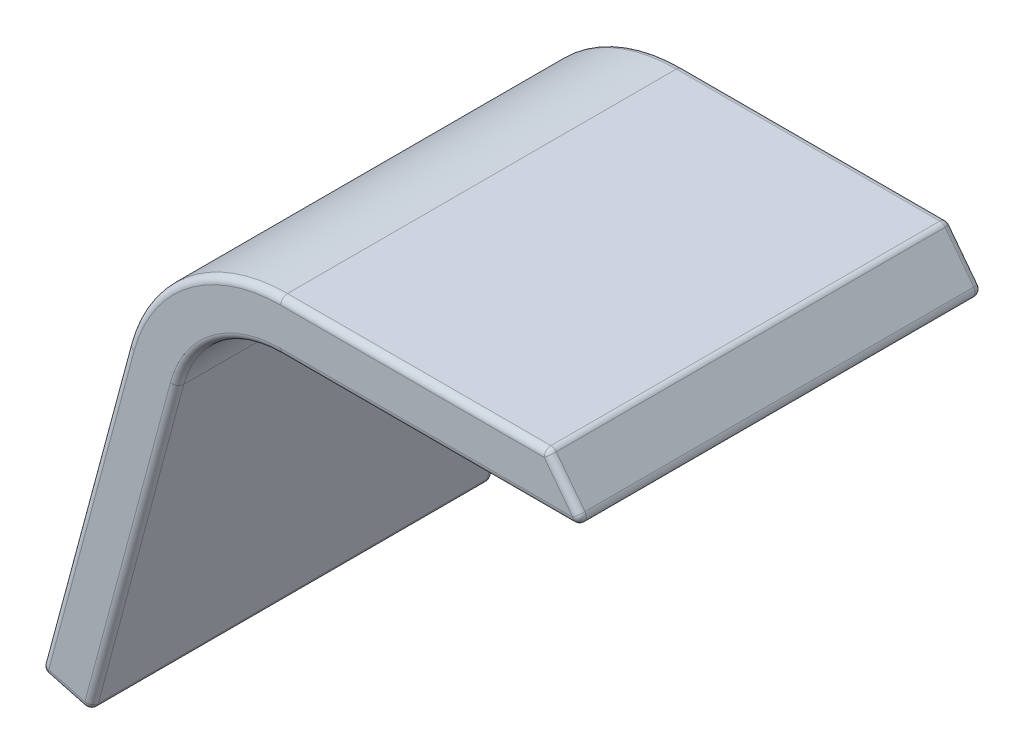
ISO-10303-21;
HEADER;
FILE_DESCRIPTION(('STEP AP214'),'2;1');
FILE_NAME('part.step','',(''),(''),'','','');
FILE_SCHEMA(('AUTOMOTIVE_DESIGN { 1 0 10303 214 1 1 1 1 }'));
ENDSEC;
DATA;
#1=APPLICATION_CONTEXT('core data for automotive mechanical design processes');
#2=APPLICATION_PROTOCOL_DEFINITION('international standard','automotive_design',2000,#1);
#3=PRODUCT_CONTEXT('',#1,'mechanical');
#4=PRODUCT('Part','Part','',(#3));
#5=PRODUCT_RELATED_PRODUCT_CATEGORY('part','',(#4));
#6=PRODUCT_DEFINITION_FORMATION('','',#4);
#7=PRODUCT_DEFINITION_CONTEXT('part definition',#1,'design');
#8=PRODUCT_DEFINITION('design','',#6,#7);
#9=PRODUCT_DEFINITION_SHAPE('','',#8);
#10=(LENGTH_UNIT() NAMED_UNIT(*) SI_UNIT(.MILLI.,.METRE.));
#11=(NAMED_UNIT(*) PLANE_ANGLE_UNIT() SI_UNIT($,.RADIAN.));
#12=(NAMED_UNIT(*) SI_UNIT($,.STERADIAN.) SOLID_ANGLE_UNIT());
#13=UNCERTAINTY_MEASURE_WITH_UNIT(LENGTH_MEASURE(1.E-05),#10,'distance_accuracy_value','');
#14=(GEOMETRIC_REPRESENTATION_CONTEXT(3) GLOBAL_UNCERTAINTY_ASSIGNED_CONTEXT((#13)) GLOBAL_UNIT_ASSIGNED_CONTEXT((#10,
#11,#12)) REPRESENTATION_CONTEXT('',''));
#15=CARTESIAN_POINT('',(0.,0.,0.));
#16=DIRECTION('',(0.,0.,1.));
#17=DIRECTION('',(1.,0.,0.));
#18=AXIS2_PLACEMENT_3D('',#15,#16,#17);
#19=CARTESIAN_POINT('',(-225.,-158.,296.));
#20=DIRECTION('',(0.,0.,-1.));
#21=DIRECTION('',(-1.,0.,0.));
#22=AXIS2_PLACEMENT_3D('',#19,#20,#21);
#23=CYLINDRICAL_SURFACE('',#22,158.);
#24=DIRECTION('',(0.,0.,-1.));
#25=VECTOR('',#24,1.);
#26=CARTESIAN_POINT('',(-225.,0.,296.));
#27=LINE('',#26,#25);
#28=CARTESIAN_POINT('',(-225.,0.,286.));
#29=VERTEX_POINT('',#28);
#30=CARTESIAN_POINT('',(-225.,0.,-286.));
#31=VERTEX_POINT('',#30);
#32=EDGE_CURVE('E197',#29,#31,#27,.T.);
#33=ORIENTED_EDGE('',*,*,#32,.F.);
#34=CARTESIAN_POINT('',(-225.,-158.,286.));
#35=DIRECTION('',(0.,0.,1.));
#36=DIRECTION('',(1.,0.,0.));
#37=AXIS2_PLACEMENT_3D('',#34,#35,#36);
#38=CIRCLE('',#37,158.);
#39=CARTESIAN_POINT('',(-377.616280553673,-117.106590873802,286.));
#40=VERTEX_POINT('',#39);
#41=EDGE_CURVE('E311',#29,#40,#38,.T.);
#42=ORIENTED_EDGE('',*,*,#41,.T.);
#43=DIRECTION('',(0.,0.,-1.));
#44=VECTOR('',#43,1.);
#45=CARTESIAN_POINT('',(-377.616280553673,-117.106590873802,296.));
#46=LINE('',#45,#44);
#47=CARTESIAN_POINT('',(-377.616280553673,-117.106590873802,-286.));
#48=VERTEX_POINT('',#47);
#49=EDGE_CURVE('E258',#40,#48,#46,.T.);
#50=ORIENTED_EDGE('',*,*,#49,.T.);
#51=CARTESIAN_POINT('',(-225.,-158.,-286.));
#52=DIRECTION('',(0.,0.,1.));
#53=DIRECTION('',(1.,0.,0.));
#54=AXIS2_PLACEMENT_3D('',#51,#52,#53);
#55=CIRCLE('',#54,158.);
#56=EDGE_CURVE('E313',#48,#31,#55,.F.);
#57=ORIENTED_EDGE('',*,*,#56,.T.);
#58=EDGE_LOOP('',(#33,#42,#50,#57));
#59=FACE_BOUND('',#58,.T.);
#60=ADVANCED_FACE('F43',(#59),#23,.F.);
#61=CARTESIAN_POINT('',(0.,0.,296.));
#62=DIRECTION('',(0.,1.,0.));
#63=DIRECTION('',(-1.,0.,0.));
#64=AXIS2_PLACEMENT_3D('',#61,#62,#63);
#65=PLANE('',#64);
#66=DIRECTION('',(0.,0.,-1.));
#67=VECTOR('',#66,1.);
#68=CARTESIAN_POINT('',(204.722005980108,0.,296.));
#69=LINE('',#68,#67);
#70=CARTESIAN_POINT('',(204.722005980108,0.,-286.));
#71=VERTEX_POINT('',#70);
#72=CARTESIAN_POINT('',(204.722005980108,0.,286.));
#73=VERTEX_POINT('',#72);
#74=EDGE_CURVE('E333',#71,#73,#69,.F.);
#75=ORIENTED_EDGE('',*,*,#74,.T.);
#76=DIRECTION('',(1.,0.,0.));
#77=VECTOR('',#76,1.);
#78=CARTESIAN_POINT('',(-225.,0.,286.));
#79=LINE('',#78,#77);
#80=EDGE_CURVE('E337',#73,#29,#79,.F.);
#81=ORIENTED_EDGE('',*,*,#80,.T.);
#82=ORIENTED_EDGE('',*,*,#32,.T.);
#83=DIRECTION('',(1.,0.,0.));
#84=VECTOR('',#83,1.);
#85=CARTESIAN_POINT('',(0.,0.,-286.));
#86=LINE('',#85,#84);
#87=EDGE_CURVE('E340',#31,#71,#86,.T.);
#88=ORIENTED_EDGE('',*,*,#87,.T.);
#89=EDGE_LOOP('',(#75,#81,#82,#88));
#90=FACE_BOUND('',#89,.T.);
#91=ADVANCED_FACE('F437',(#90),#65,.F.);
#92=CARTESIAN_POINT('',(141.617142574032,108.666655457521,296.));
#93=DIRECTION('',(-0.793353340291232,-0.608761429008725,0.));
#94=DIRECTION('',(0.608761429008725,-0.793353340291232,0.));
#95=AXIS2_PLACEMENT_3D('',#92,#93,#94);
#96=PLANE('',#95);
#97=DIRECTION('',(-0.608761429008725,0.793353340291232,0.));
#98=VECTOR('',#97,1.);
#99=CARTESIAN_POINT('',(225.,0.,286.));
#100=LINE('',#99,#98);
#101=CARTESIAN_POINT('',(170.452555044177,71.0876142900873,286.));
#102=VERTEX_POINT('',#101);
#103=CARTESIAN_POINT('',(212.65553938302,16.0876142900873,286.));
#104=VERTEX_POINT('',#103);
#105=EDGE_CURVE('E208',#102,#104,#100,.F.);
#106=ORIENTED_EDGE('',*,*,#105,.T.);
#107=DIRECTION('',(0.,0.,-1.));
#108=VECTOR('',#107,1.);
#109=CARTESIAN_POINT('',(212.65553938302,16.0876142900873,296.));
#110=LINE('',#109,#108);
#111=CARTESIAN_POINT('',(212.65553938302,16.0876142900873,-286.));
#112=VERTEX_POINT('',#111);
#113=EDGE_CURVE('E347',#104,#112,#110,.T.);
#114=ORIENTED_EDGE('',*,*,#113,.T.);
#115=DIRECTION('',(-0.608761429008725,0.793353340291232,0.));
#116=VECTOR('',#115,1.);
#117=CARTESIAN_POINT('',(141.617142574032,108.666655457521,-286.));
#118=LINE('',#117,#116);
#119=CARTESIAN_POINT('',(170.452555044177,71.0876142900873,-286.));
#120=VERTEX_POINT('',#119);
#121=EDGE_CURVE('E345',#112,#120,#118,.T.);
#122=ORIENTED_EDGE('',*,*,#121,.T.);
#123=DIRECTION('',(0.,0.,-1.));
#124=VECTOR('',#123,1.);
#125=CARTESIAN_POINT('',(170.452555044177,71.0876142900873,296.));
#126=LINE('',#125,#124);
#127=EDGE_CURVE('E344',#120,#102,#126,.F.);
#128=ORIENTED_EDGE('',*,*,#127,.T.);
#129=EDGE_LOOP('',(#106,#114,#122,#128));
#130=FACE_BOUND('',#129,.T.);
#131=ADVANCED_FACE('F484',(#130),#96,.F.);
#132=CARTESIAN_POINT('',(0.,75.,296.));
#133=DIRECTION('',(0.,-1.,0.));
#134=DIRECTION('',(1.,0.,0.));
#135=AXIS2_PLACEMENT_3D('',#132,#133,#134);
#136=PLANE('',#135);
#137=DIRECTION('',(0.,0.,-1.));
#138=VECTOR('',#137,1.);
#139=CARTESIAN_POINT('',(-225.,75.,296.));
#140=LINE('',#139,#138);
#141=CARTESIAN_POINT('',(-225.,75.,286.));
#142=VERTEX_POINT('',#141);
#143=CARTESIAN_POINT('',(-225.,75.,-286.));
#144=VERTEX_POINT('',#143);
#145=EDGE_CURVE('E268',#142,#144,#140,.T.);
#146=ORIENTED_EDGE('',*,*,#145,.F.);
#147=DIRECTION('',(-1.,0.,0.));
#148=VECTOR('',#147,1.);
#149=CARTESIAN_POINT('',(167.450475901577,75.,286.));
#150=LINE('',#149,#148);
#151=CARTESIAN_POINT('',(162.519021641264,75.,286.));
#152=VERTEX_POINT('',#151);
#153=EDGE_CURVE('E11',#142,#152,#150,.F.);
#154=ORIENTED_EDGE('',*,*,#153,.T.);
#155=DIRECTION('',(0.,0.,-1.));
#156=VECTOR('',#155,1.);
#157=CARTESIAN_POINT('',(162.519021641264,75.,296.));
#158=LINE('',#157,#156);
#159=CARTESIAN_POINT('',(162.519021641264,75.,-286.));
#160=VERTEX_POINT('',#159);
#161=EDGE_CURVE('E55',#152,#160,#158,.T.);
#162=ORIENTED_EDGE('',*,*,#161,.T.);
#163=DIRECTION('',(-1.,0.,0.));
#164=VECTOR('',#163,1.);
#165=CARTESIAN_POINT('',(0.,75.,-286.));
#166=LINE('',#165,#164);
#167=EDGE_CURVE('E349',#160,#144,#166,.T.);
#168=ORIENTED_EDGE('',*,*,#167,.T.);
#169=EDGE_LOOP('',(#146,#154,#162,#168));
#170=FACE_BOUND('',#169,.T.);
#171=ADVANCED_FACE('F761',(#170),#136,.F.);
#172=CARTESIAN_POINT('',(-225.,-158.,296.));
#173=DIRECTION('',(0.,0.,-1.));
#174=DIRECTION('',(-1.,0.,0.));
#175=AXIS2_PLACEMENT_3D('',#172,#173,#174);
#176=CYLINDRICAL_SURFACE('',#175,233.);
#177=DIRECTION('',(0.,0.,-1.));
#178=VECTOR('',#177,1.);
#179=CARTESIAN_POINT('',(-450.060717525353,-97.6951624911134,296.));
#180=LINE('',#179,#178);
#181=CARTESIAN_POINT('',(-450.060717525353,-97.6951624911134,286.));
#182=VERTEX_POINT('',#181);
#183=CARTESIAN_POINT('',(-450.060717525353,-97.6951624911134,-286.));
#184=VERTEX_POINT('',#183);
#185=EDGE_CURVE('E265',#182,#184,#180,.T.);
#186=ORIENTED_EDGE('',*,*,#185,.F.);
#187=CARTESIAN_POINT('',(-225.,-158.,286.));
#188=DIRECTION('',(0.,0.,1.));
#189=DIRECTION('',(1.,0.,0.));
#190=AXIS2_PLACEMENT_3D('',#187,#188,#189);
#191=CIRCLE('',#190,233.);
#192=EDGE_CURVE('E320',#182,#142,#191,.F.);
#193=ORIENTED_EDGE('',*,*,#192,.T.);
#194=ORIENTED_EDGE('',*,*,#145,.T.);
#195=CARTESIAN_POINT('',(-225.,-158.,-286.));
#196=DIRECTION('',(0.,0.,1.));
#197=DIRECTION('',(1.,0.,0.));
#198=AXIS2_PLACEMENT_3D('',#195,#196,#197);
#199=CIRCLE('',#198,233.);
#200=EDGE_CURVE('E312',#144,#184,#199,.T.);
#201=ORIENTED_EDGE('',*,*,#200,.T.);
#202=EDGE_LOOP('',(#186,#193,#194,#201));
#203=FACE_BOUND('',#202,.T.);
#204=ADVANCED_FACE('F755',(#203),#176,.T.);
#205=CARTESIAN_POINT('',(-395.488575451103,105.970844407857,296.));
#206=DIRECTION('',(0.965925826289069,-0.258819045102518,0.));
#207=DIRECTION('',(0.258819045102518,0.965925826289069,0.));
#208=AXIS2_PLACEMENT_3D('',#205,#206,#207);
#209=PLANE('',#208);
#210=DIRECTION('',(0.,0.,-1.));
#211=VECTOR('',#210,1.);
#212=CARTESIAN_POINT('',(-575.846773445177,-567.135114067601,296.));
#213=LINE('',#212,#211);
#214=CARTESIAN_POINT('',(-575.846773445177,-567.135114067601,-286.));
#215=VERTEX_POINT('',#214);
#216=CARTESIAN_POINT('',(-575.846773445177,-567.135114067601,286.));
#217=VERTEX_POINT('',#216);
#218=EDGE_CURVE('E319',#215,#217,#213,.F.);
#219=ORIENTED_EDGE('',*,*,#218,.T.);
#220=DIRECTION('',(-0.258819045102518,-0.965925826289069,0.));
#221=VECTOR('',#220,1.);
#222=CARTESIAN_POINT('',(-450.060717525353,-97.6951624911134,286.));
#223=LINE('',#222,#221);
#224=EDGE_CURVE('E322',#217,#182,#223,.F.);
#225=ORIENTED_EDGE('',*,*,#224,.T.);
#226=ORIENTED_EDGE('',*,*,#185,.T.);
#227=DIRECTION('',(-0.258819045102518,-0.965925826289069,0.));
#228=VECTOR('',#227,1.);
#229=CARTESIAN_POINT('',(-395.488575451103,105.970844407857,-286.));
#230=LINE('',#229,#228);
#231=EDGE_CURVE('E325',#184,#215,#230,.T.);
#232=ORIENTED_EDGE('',*,*,#231,.T.);
#233=EDGE_LOOP('',(#219,#225,#226,#232));
#234=FACE_BOUND('',#233,.T.);
#235=ADVANCED_FACE('F743',(#234),#209,.F.);
#236=CARTESIAN_POINT('',(-182.946388445098,-682.765216738348,296.));
#237=DIRECTION('',(0.258819045102517,0.965925826289069,0.));
#238=DIRECTION('',(-0.965925826289069,0.258819045102517,0.));
#239=AXIS2_PLACEMENT_3D('',#236,#237,#238);
#240=PLANE('',#239);
#241=DIRECTION('',(0.965925826289069,-0.258819045102517,0.));
#242=VECTOR('',#241,1.);
#243=CARTESIAN_POINT('',(-578.434963896202,-576.794372330492,286.));
#244=LINE('',#243,#242);
#245=CARTESIAN_POINT('',(-515.649785187412,-593.617610262155,286.));
#246=VERTEX_POINT('',#245);
#247=CARTESIAN_POINT('',(-568.775705633311,-579.382562781517,286.));
#248=VERTEX_POINT('',#247);
#249=EDGE_CURVE('E329',#246,#248,#244,.F.);
#250=ORIENTED_EDGE('',*,*,#249,.T.);
#251=DIRECTION('',(0.,0.,-1.));
#252=VECTOR('',#251,1.);
#253=CARTESIAN_POINT('',(-568.775705633311,-579.382562781517,296.));
#254=LINE('',#253,#252);
#255=CARTESIAN_POINT('',(-568.775705633311,-579.382562781517,-286.));
#256=VERTEX_POINT('',#255);
#257=EDGE_CURVE('E335',#248,#256,#254,.T.);
#258=ORIENTED_EDGE('',*,*,#257,.T.);
#259=DIRECTION('',(0.965925826289069,-0.258819045102517,0.));
#260=VECTOR('',#259,1.);
#261=CARTESIAN_POINT('',(-182.946388445098,-682.765216738348,-286.));
#262=LINE('',#261,#260);
#263=CARTESIAN_POINT('',(-515.649785187412,-593.617610262155,-286.));
#264=VERTEX_POINT('',#263);
#265=EDGE_CURVE('E326',#256,#264,#262,.T.);
#266=ORIENTED_EDGE('',*,*,#265,.T.);
#267=DIRECTION('',(0.,0.,-1.));
#268=VECTOR('',#267,1.);
#269=CARTESIAN_POINT('',(-515.649785187412,-593.617610262155,296.));
#270=LINE('',#269,#268);
#271=EDGE_CURVE('E327',#264,#246,#270,.F.);
#272=ORIENTED_EDGE('',*,*,#271,.T.);
#273=EDGE_LOOP('',(#250,#258,#266,#272));
#274=FACE_BOUND('',#273,.T.);
#275=ADVANCED_FACE('F401',(#274),#240,.F.);
#276=CARTESIAN_POINT('',(-323.044138479423,86.559416025168,296.));
#277=DIRECTION('',(-0.965925826289069,0.258819045102517,0.));
#278=DIRECTION('',(-0.258819045102517,-0.965925826289069,0.));
#279=AXIS2_PLACEMENT_3D('',#276,#277,#278);
#280=PLANE('',#279);
#281=ORIENTED_EDGE('',*,*,#49,.F.);
#282=DIRECTION('',(0.258819045102517,0.965925826289069,0.));
#283=VECTOR('',#282,1.);
#284=CARTESIAN_POINT('',(-505.990526924522,-596.205800713181,286.));
#285=LINE('',#284,#283);
#286=CARTESIAN_POINT('',(-503.402336473496,-586.54654245029,286.));
#287=VERTEX_POINT('',#286);
#288=EDGE_CURVE('E292',#40,#287,#285,.F.);
#289=ORIENTED_EDGE('',*,*,#288,.T.);
#290=DIRECTION('',(0.,0.,-1.));
#291=VECTOR('',#290,1.);
#292=CARTESIAN_POINT('',(-503.402336473496,-586.54654245029,296.));
#293=LINE('',#292,#291);
#294=CARTESIAN_POINT('',(-503.402336473496,-586.54654245029,-286.));
#295=VERTEX_POINT('',#294);
#296=EDGE_CURVE('E286',#287,#295,#293,.T.);
#297=ORIENTED_EDGE('',*,*,#296,.T.);
#298=DIRECTION('',(0.258819045102517,0.965925826289069,0.));
#299=VECTOR('',#298,1.);
#300=CARTESIAN_POINT('',(-323.044138479423,86.559416025168,-286.));
#301=LINE('',#300,#299);
#302=EDGE_CURVE('E288',#295,#48,#301,.T.);
#303=ORIENTED_EDGE('',*,*,#302,.T.);
#304=EDGE_LOOP('',(#281,#289,#297,#303));
#305=FACE_BOUND('',#304,.T.);
#306=ADVANCED_FACE('F469',(#305),#280,.F.);
#307=CARTESIAN_POINT('',(0.,0.,296.));
#308=DIRECTION('',(0.,0.,1.));
#309=DIRECTION('',(1.,0.,0.));
#310=AXIS2_PLACEMENT_3D('',#307,#308,#309);
#311=PLANE('',#310);
#312=CARTESIAN_POINT('',(-225.,-158.,296.));
#313=DIRECTION('',(0.,0.,1.));
#314=DIRECTION('',(1.,0.,0.));
#315=AXIS2_PLACEMENT_3D('',#312,#313,#314);
#316=CIRCLE('',#315,223.);
#317=CARTESIAN_POINT('',(-225.,65.,296.));
#318=VERTEX_POINT('',#317);
#319=CARTESIAN_POINT('',(-440.401459262462,-100.283352942139,296.));
#320=VERTEX_POINT('',#319);
#321=EDGE_CURVE('E277',#318,#320,#316,.T.);
#322=ORIENTED_EDGE('',*,*,#321,.T.);
#323=DIRECTION('',(-0.258819045102518,-0.965925826289069,0.));
#324=VECTOR('',#323,1.);
#325=CARTESIAN_POINT('',(-568.775705633311,-579.382562781517,296.));
#326=LINE('',#325,#324);
#327=CARTESIAN_POINT('',(-566.187515182286,-569.723304518626,296.));
#328=VERTEX_POINT('',#327);
#329=EDGE_CURVE('E284',#320,#328,#326,.T.);
#330=ORIENTED_EDGE('',*,*,#329,.T.);
#331=DIRECTION('',(0.965925826289069,-0.258819045102517,0.));
#332=VECTOR('',#331,1.);
#333=CARTESIAN_POINT('',(-503.402336473496,-586.54654245029,296.));
#334=LINE('',#333,#332);
#335=CARTESIAN_POINT('',(-513.061594736387,-583.958351999265,296.));
#336=VERTEX_POINT('',#335);
#337=EDGE_CURVE('E281',#328,#336,#334,.T.);
#338=ORIENTED_EDGE('',*,*,#337,.T.);
#339=DIRECTION('',(0.258819045102517,0.965925826289069,0.));
#340=VECTOR('',#339,1.);
#341=CARTESIAN_POINT('',(-387.275538816564,-114.518400422777,296.));
#342=LINE('',#341,#340);
#343=CARTESIAN_POINT('',(-387.275538816564,-114.518400422777,296.));
#344=VERTEX_POINT('',#343);
#345=EDGE_CURVE('E278',#336,#344,#342,.T.);
#346=ORIENTED_EDGE('',*,*,#345,.T.);
#347=CARTESIAN_POINT('',(-225.,-158.,296.));
#348=DIRECTION('',(0.,0.,1.));
#349=DIRECTION('',(1.,0.,0.));
#350=AXIS2_PLACEMENT_3D('',#347,#348,#349);
#351=CIRCLE('',#350,168.);
#352=CARTESIAN_POINT('',(-225.,10.,296.));
#353=VERTEX_POINT('',#352);
#354=EDGE_CURVE('E279',#344,#353,#351,.F.);
#355=ORIENTED_EDGE('',*,*,#354,.T.);
#356=DIRECTION('',(1.,0.,0.));
#357=VECTOR('',#356,1.);
#358=CARTESIAN_POINT('',(225.,10.0000000000001,296.));
#359=LINE('',#358,#357);
#360=CARTESIAN_POINT('',(204.722005980108,10.0000000000001,296.));
#361=VERTEX_POINT('',#360);
#362=EDGE_CURVE('E181',#353,#361,#359,.T.);
#363=ORIENTED_EDGE('',*,*,#362,.T.);
#364=DIRECTION('',(-0.608761429008725,0.793353340291232,0.));
#365=VECTOR('',#364,1.);
#366=CARTESIAN_POINT('',(159.516942498665,68.9123857099128,296.));
#367=LINE('',#366,#365);
#368=CARTESIAN_POINT('',(162.519021641264,65.,296.));
#369=VERTEX_POINT('',#368);
#370=EDGE_CURVE('E176',#361,#369,#367,.T.);
#371=ORIENTED_EDGE('',*,*,#370,.T.);
#372=DIRECTION('',(-1.,0.,0.));
#373=VECTOR('',#372,1.);
#374=CARTESIAN_POINT('',(-225.,65.,296.));
#375=LINE('',#374,#373);
#376=EDGE_CURVE('E177',#369,#318,#375,.T.);
#377=ORIENTED_EDGE('',*,*,#376,.T.);
#378=EDGE_LOOP('',(#322,#330,#338,#346,#355,#363,#371,#377));
#379=FACE_BOUND('',#378,.T.);
#380=ADVANCED_FACE('F178',(#379),#311,.T.);
#381=CARTESIAN_POINT('',(0.,0.,-296.));
#382=DIRECTION('',(0.,0.,1.));
#383=DIRECTION('',(1.,0.,0.));
#384=AXIS2_PLACEMENT_3D('',#381,#382,#383);
#385=PLANE('',#384);
#386=DIRECTION('',(0.965925826289069,-0.258819045102517,0.));
#387=VECTOR('',#386,1.);
#388=CARTESIAN_POINT('',(-180.358197994073,-673.105958475458,-296.));
#389=LINE('',#388,#387);
#390=CARTESIAN_POINT('',(-513.061594736387,-583.958351999265,-296.));
#391=VERTEX_POINT('',#390);
#392=CARTESIAN_POINT('',(-566.187515182286,-569.723304518626,-296.));
#393=VERTEX_POINT('',#392);
#394=EDGE_CURVE('E307',#391,#393,#389,.F.);
#395=ORIENTED_EDGE('',*,*,#394,.T.);
#396=DIRECTION('',(-0.258819045102518,-0.965925826289069,0.));
#397=VECTOR('',#396,1.);
#398=CARTESIAN_POINT('',(-385.829317188212,103.382653956832,-296.));
#399=LINE('',#398,#397);
#400=CARTESIAN_POINT('',(-440.401459262462,-100.283352942139,-296.));
#401=VERTEX_POINT('',#400);
#402=EDGE_CURVE('E310',#393,#401,#399,.F.);
#403=ORIENTED_EDGE('',*,*,#402,.T.);
#404=CARTESIAN_POINT('',(-225.,-158.,-296.));
#405=DIRECTION('',(0.,0.,1.));
#406=DIRECTION('',(1.,0.,0.));
#407=AXIS2_PLACEMENT_3D('',#404,#405,#406);
#408=CIRCLE('',#407,223.);
#409=CARTESIAN_POINT('',(-225.,65.,-296.));
#410=VERTEX_POINT('',#409);
#411=EDGE_CURVE('E299',#401,#410,#408,.F.);
#412=ORIENTED_EDGE('',*,*,#411,.T.);
#413=DIRECTION('',(-1.,0.,0.));
#414=VECTOR('',#413,1.);
#415=CARTESIAN_POINT('',(0.,65.,-296.));
#416=LINE('',#415,#414);
#417=CARTESIAN_POINT('',(162.519021641264,65.,-296.));
#418=VERTEX_POINT('',#417);
#419=EDGE_CURVE('E294',#410,#418,#416,.F.);
#420=ORIENTED_EDGE('',*,*,#419,.T.);
#421=DIRECTION('',(-0.608761429008725,0.793353340291232,0.));
#422=VECTOR('',#421,1.);
#423=CARTESIAN_POINT('',(133.68360917112,102.579041167433,-296.));
#424=LINE('',#423,#422);
#425=CARTESIAN_POINT('',(204.722005980108,10.0000000000001,-296.));
#426=VERTEX_POINT('',#425);
#427=EDGE_CURVE('E298',#418,#426,#424,.F.);
#428=ORIENTED_EDGE('',*,*,#427,.T.);
#429=DIRECTION('',(1.,0.,0.));
#430=VECTOR('',#429,1.);
#431=CARTESIAN_POINT('',(0.,10.,-296.));
#432=LINE('',#431,#430);
#433=CARTESIAN_POINT('',(-225.,10.,-296.));
#434=VERTEX_POINT('',#433);
#435=EDGE_CURVE('E296',#426,#434,#432,.F.);
#436=ORIENTED_EDGE('',*,*,#435,.T.);
#437=CARTESIAN_POINT('',(-225.,-158.,-296.));
#438=DIRECTION('',(0.,0.,1.));
#439=DIRECTION('',(1.,0.,0.));
#440=AXIS2_PLACEMENT_3D('',#437,#438,#439);
#441=CIRCLE('',#440,168.);
#442=CARTESIAN_POINT('',(-387.275538816564,-114.518400422777,-296.));
#443=VERTEX_POINT('',#442);
#444=EDGE_CURVE('E301',#434,#443,#441,.T.);
#445=ORIENTED_EDGE('',*,*,#444,.T.);
#446=DIRECTION('',(0.258819045102517,0.965925826289069,0.));
#447=VECTOR('',#446,1.);
#448=CARTESIAN_POINT('',(-332.703396742314,89.1476064761931,-296.));
#449=LINE('',#448,#447);
#450=EDGE_CURVE('E303',#443,#391,#449,.F.);
#451=ORIENTED_EDGE('',*,*,#450,.T.);
#452=EDGE_LOOP('',(#395,#403,#412,#420,#428,#436,#445,#451));
#453=FACE_BOUND('',#452,.T.);
#454=ADVANCED_FACE('F430',(#453),#385,.F.);
#455=CARTESIAN_POINT('',(0.,65.,-286.));
#456=DIRECTION('',(-1.,0.,0.));
#457=DIRECTION('',(0.,-1.,0.));
#458=AXIS2_PLACEMENT_3D('',#455,#456,#457);
#459=CYLINDRICAL_SURFACE('',#458,10.);
#460=CARTESIAN_POINT('',(162.519021641264,65.,-286.));
#461=DIRECTION('',(1.,0.,0.));
#462=DIRECTION('',(0.,0.,-1.));
#463=AXIS2_PLACEMENT_3D('',#460,#461,#462);
#464=CIRCLE('',#463,10.);
#465=EDGE_CURVE('E248',#418,#160,#464,.T.);
#466=ORIENTED_EDGE('',*,*,#465,.F.);
#467=ORIENTED_EDGE('',*,*,#419,.F.);
#468=CARTESIAN_POINT('',(-225.,65.,-286.));
#469=DIRECTION('',(-1.,0.,0.));
#470=DIRECTION('',(0.,0.,1.));
#471=AXIS2_PLACEMENT_3D('',#468,#469,#470);
#472=CIRCLE('',#471,10.);
#473=EDGE_CURVE('E50',#144,#410,#472,.T.);
#474=ORIENTED_EDGE('',*,*,#473,.F.);
#475=ORIENTED_EDGE('',*,*,#167,.F.);
#476=EDGE_LOOP('',(#466,#467,#474,#475));
#477=FACE_BOUND('',#476,.T.);
#478=ADVANCED_FACE('F44',(#477),#459,.T.);
#479=CARTESIAN_POINT('',(-225.,-158.,-286.));
#480=DIRECTION('',(0.,0.,1.));
#481=DIRECTION('',(1.,0.,0.));
#482=AXIS2_PLACEMENT_3D('',#479,#480,#481);
#483=TOROIDAL_SURFACE('',#482,223.,10.);
#484=ORIENTED_EDGE('',*,*,#473,.T.);
#485=ORIENTED_EDGE('',*,*,#411,.F.);
#486=CARTESIAN_POINT('',(-440.401459262462,-100.283352942139,-286.));
#487=DIRECTION('',(-0.258819045102517,-0.965925826289069,0.));
#488=DIRECTION('',(0.965925826289069,-0.258819045102517,0.));
#489=AXIS2_PLACEMENT_3D('',#486,#487,#488);
#490=CIRCLE('',#489,10.);
#491=EDGE_CURVE('E246',#184,#401,#490,.T.);
#492=ORIENTED_EDGE('',*,*,#491,.F.);
#493=ORIENTED_EDGE('',*,*,#200,.F.);
#494=EDGE_LOOP('',(#484,#485,#492,#493));
#495=FACE_BOUND('',#494,.T.);
#496=ADVANCED_FACE('F698',(#495),#483,.T.);
#497=CARTESIAN_POINT('',(162.519021641264,65.,-286.));
#498=DIRECTION('',(0.,0.,-1.));
#499=DIRECTION('',(-1.,0.,0.));
#500=AXIS2_PLACEMENT_3D('',#497,#498,#499);
#501=SPHERICAL_SURFACE('',#500,10.);
#502=CARTESIAN_POINT('',(162.519021641264,65.,-286.));
#503=DIRECTION('',(-0.608761429008726,0.793353340291231,0.));
#504=DIRECTION('',(-0.793353340291231,-0.608761429008726,0.));
#505=AXIS2_PLACEMENT_3D('',#502,#503,#504);
#506=CIRCLE('',#505,10.);
#507=EDGE_CURVE('E243',#418,#120,#506,.F.);
#508=ORIENTED_EDGE('',*,*,#507,.F.);
#509=ORIENTED_EDGE('',*,*,#465,.T.);
#510=CARTESIAN_POINT('',(162.519021641264,65.,-286.));
#511=DIRECTION('',(0.,0.,-1.));
#512=DIRECTION('',(-1.,0.,0.));
#513=AXIS2_PLACEMENT_3D('',#510,#511,#512);
#514=CIRCLE('',#513,10.);
#515=EDGE_CURVE('E242',#120,#160,#514,.F.);
#516=ORIENTED_EDGE('',*,*,#515,.F.);
#517=EDGE_LOOP('',(#508,#509,#516));
#518=FACE_BOUND('',#517,.T.);
#519=ADVANCED_FACE('F689',(#518),#501,.T.);
#520=CARTESIAN_POINT('',(-385.829317188212,103.382653956832,-286.));
#521=DIRECTION('',(-0.258819045102518,-0.965925826289069,0.));
#522=DIRECTION('',(0.965925826289069,-0.258819045102518,0.));
#523=AXIS2_PLACEMENT_3D('',#520,#521,#522);
#524=CYLINDRICAL_SURFACE('',#523,10.);
#525=ORIENTED_EDGE('',*,*,#491,.T.);
#526=ORIENTED_EDGE('',*,*,#402,.F.);
#527=CARTESIAN_POINT('',(-566.187515182286,-569.723304518626,-286.));
#528=DIRECTION('',(-0.25881904510252,-0.965925826289069,0.));
#529=DIRECTION('',(0.965925826289069,-0.25881904510252,0.));
#530=AXIS2_PLACEMENT_3D('',#527,#528,#529);
#531=CIRCLE('',#530,10.);
#532=EDGE_CURVE('E232',#215,#393,#531,.T.);
#533=ORIENTED_EDGE('',*,*,#532,.F.);
#534=ORIENTED_EDGE('',*,*,#231,.F.);
#535=EDGE_LOOP('',(#525,#526,#533,#534));
#536=FACE_BOUND('',#535,.T.);
#537=ADVANCED_FACE('F680',(#536),#524,.T.);
#538=CARTESIAN_POINT('',(0.,65.,286.));
#539=DIRECTION('',(1.,0.,0.));
#540=DIRECTION('',(0.,1.,0.));
#541=AXIS2_PLACEMENT_3D('',#538,#539,#540);
#542=CYLINDRICAL_SURFACE('',#541,10.);
#543=CARTESIAN_POINT('',(162.519021641264,65.,286.));
#544=DIRECTION('',(1.,0.,0.));
#545=DIRECTION('',(0.,0.,-1.));
#546=AXIS2_PLACEMENT_3D('',#543,#544,#545);
#547=CIRCLE('',#546,10.);
#548=EDGE_CURVE('E195',#152,#369,#547,.T.);
#549=ORIENTED_EDGE('',*,*,#548,.F.);
#550=ORIENTED_EDGE('',*,*,#153,.F.);
#551=CARTESIAN_POINT('',(-225.,65.,286.));
#552=DIRECTION('',(-1.,0.,0.));
#553=DIRECTION('',(0.,0.,1.));
#554=AXIS2_PLACEMENT_3D('',#551,#552,#553);
#555=CIRCLE('',#554,10.);
#556=EDGE_CURVE('E192',#318,#142,#555,.T.);
#557=ORIENTED_EDGE('',*,*,#556,.F.);
#558=ORIENTED_EDGE('',*,*,#376,.F.);
#559=EDGE_LOOP('',(#549,#550,#557,#558));
#560=FACE_BOUND('',#559,.T.);
#561=ADVANCED_FACE('F191',(#560),#542,.T.);
#562=CARTESIAN_POINT('',(162.519021641264,65.,296.));
#563=DIRECTION('',(0.,0.,-1.));
#564=DIRECTION('',(-1.,0.,0.));
#565=AXIS2_PLACEMENT_3D('',#562,#563,#564);
#566=CYLINDRICAL_SURFACE('',#565,10.);
#567=ORIENTED_EDGE('',*,*,#515,.T.);
#568=ORIENTED_EDGE('',*,*,#161,.F.);
#569=CARTESIAN_POINT('',(162.519021641264,65.,286.));
#570=DIRECTION('',(0.,0.,1.));
#571=DIRECTION('',(1.,0.,0.));
#572=AXIS2_PLACEMENT_3D('',#569,#570,#571);
#573=CIRCLE('',#572,10.);
#574=EDGE_CURVE('E202',#102,#152,#573,.T.);
#575=ORIENTED_EDGE('',*,*,#574,.F.);
#576=ORIENTED_EDGE('',*,*,#127,.F.);
#577=EDGE_LOOP('',(#567,#568,#575,#576));
#578=FACE_BOUND('',#577,.T.);
#579=ADVANCED_FACE('F657',(#578),#566,.T.);
#580=CARTESIAN_POINT('',(133.68360917112,102.579041167433,-286.));
#581=DIRECTION('',(-0.608761429008725,0.793353340291232,0.));
#582=DIRECTION('',(-0.793353340291232,-0.608761429008725,0.));
#583=AXIS2_PLACEMENT_3D('',#580,#581,#582);
#584=CYLINDRICAL_SURFACE('',#583,10.);
#585=ORIENTED_EDGE('',*,*,#507,.T.);
#586=ORIENTED_EDGE('',*,*,#121,.F.);
#587=CARTESIAN_POINT('',(204.722005980108,10.0000000000001,-286.));
#588=DIRECTION('',(0.608761429008725,-0.793353340291232,0.));
#589=DIRECTION('',(0.793353340291232,0.608761429008725,0.));
#590=AXIS2_PLACEMENT_3D('',#587,#588,#589);
#591=CIRCLE('',#590,10.);
#592=EDGE_CURVE('E229',#426,#112,#591,.T.);
#593=ORIENTED_EDGE('',*,*,#592,.F.);
#594=ORIENTED_EDGE('',*,*,#427,.F.);
#595=EDGE_LOOP('',(#585,#586,#593,#594));
#596=FACE_BOUND('',#595,.T.);
#597=ADVANCED_FACE('F647',(#596),#584,.T.);
#598=CARTESIAN_POINT('',(0.,10.,-286.));
#599=DIRECTION('',(1.,0.,0.));
#600=DIRECTION('',(0.,1.,0.));
#601=AXIS2_PLACEMENT_3D('',#598,#599,#600);
#602=CYLINDRICAL_SURFACE('',#601,10.);
#603=CARTESIAN_POINT('',(204.722005980108,10.0000000000001,-286.));
#604=DIRECTION('',(1.,0.,0.));
#605=DIRECTION('',(0.,0.,-1.));
#606=AXIS2_PLACEMENT_3D('',#603,#604,#605);
#607=CIRCLE('',#606,10.);
#608=EDGE_CURVE('E230',#71,#426,#607,.T.);
#609=ORIENTED_EDGE('',*,*,#608,.F.);
#610=ORIENTED_EDGE('',*,*,#87,.F.);
#611=CARTESIAN_POINT('',(-225.,10.,-286.));
#612=DIRECTION('',(-1.,0.,0.));
#613=DIRECTION('',(0.,0.,1.));
#614=AXIS2_PLACEMENT_3D('',#611,#612,#613);
#615=CIRCLE('',#614,10.);
#616=EDGE_CURVE('E236',#434,#31,#615,.T.);
#617=ORIENTED_EDGE('',*,*,#616,.F.);
#618=ORIENTED_EDGE('',*,*,#435,.F.);
#619=EDGE_LOOP('',(#609,#610,#617,#618));
#620=FACE_BOUND('',#619,.T.);
#621=ADVANCED_FACE('F445',(#620),#602,.T.);
#622=CARTESIAN_POINT('',(-225.,-158.,-286.));
#623=DIRECTION('',(0.,0.,1.));
#624=DIRECTION('',(1.,0.,0.));
#625=AXIS2_PLACEMENT_3D('',#622,#623,#624);
#626=TOROIDAL_SURFACE('',#625,168.,10.);
#627=ORIENTED_EDGE('',*,*,#616,.T.);
#628=ORIENTED_EDGE('',*,*,#56,.F.);
#629=CARTESIAN_POINT('',(-387.275538816564,-114.518400422777,-286.));
#630=DIRECTION('',(-0.258819045102517,-0.965925826289069,0.));
#631=DIRECTION('',(0.965925826289069,-0.258819045102517,0.));
#632=AXIS2_PLACEMENT_3D('',#629,#630,#631);
#633=CIRCLE('',#632,10.);
#634=EDGE_CURVE('E221',#443,#48,#633,.T.);
#635=ORIENTED_EDGE('',*,*,#634,.F.);
#636=ORIENTED_EDGE('',*,*,#444,.F.);
#637=EDGE_LOOP('',(#627,#628,#635,#636));
#638=FACE_BOUND('',#637,.T.);
#639=ADVANCED_FACE('F435',(#638),#626,.T.);
#640=CARTESIAN_POINT('',(-566.187515182286,-569.723304518626,-286.));
#641=DIRECTION('',(0.,0.,-1.));
#642=DIRECTION('',(-1.,0.,0.));
#643=AXIS2_PLACEMENT_3D('',#640,#641,#642);
#644=SPHERICAL_SURFACE('',#643,10.);
#645=CARTESIAN_POINT('',(-566.187515182286,-569.723304518626,-286.));
#646=DIRECTION('',(0.,0.,-1.));
#647=DIRECTION('',(-1.,0.,0.));
#648=AXIS2_PLACEMENT_3D('',#645,#646,#647);
#649=CIRCLE('',#648,10.);
#650=EDGE_CURVE('E213',#215,#256,#649,.F.);
#651=ORIENTED_EDGE('',*,*,#650,.F.);
#652=ORIENTED_EDGE('',*,*,#532,.T.);
#653=CARTESIAN_POINT('',(-566.187515182286,-569.723304518626,-286.));
#654=DIRECTION('',(-0.965925826289069,0.25881904510252,0.));
#655=DIRECTION('',(-0.25881904510252,-0.965925826289069,0.));
#656=AXIS2_PLACEMENT_3D('',#653,#654,#655);
#657=CIRCLE('',#656,10.);
#658=EDGE_CURVE('E222',#256,#393,#657,.F.);
#659=ORIENTED_EDGE('',*,*,#658,.F.);
#660=EDGE_LOOP('',(#651,#652,#659));
#661=FACE_BOUND('',#660,.T.);
#662=ADVANCED_FACE('F423',(#661),#644,.T.);
#663=CARTESIAN_POINT('',(-225.,-158.,286.));
#664=DIRECTION('',(0.,0.,1.));
#665=DIRECTION('',(1.,0.,0.));
#666=AXIS2_PLACEMENT_3D('',#663,#664,#665);
#667=TOROIDAL_SURFACE('',#666,223.,10.);
#668=ORIENTED_EDGE('',*,*,#556,.T.);
#669=ORIENTED_EDGE('',*,*,#192,.F.);
#670=CARTESIAN_POINT('',(-440.401459262462,-100.283352942139,286.));
#671=DIRECTION('',(-0.258819045102517,-0.965925826289069,0.));
#672=DIRECTION('',(0.965925826289069,-0.258819045102517,0.));
#673=AXIS2_PLACEMENT_3D('',#670,#671,#672);
#674=CIRCLE('',#673,10.);
#675=EDGE_CURVE('E207',#320,#182,#674,.T.);
#676=ORIENTED_EDGE('',*,*,#675,.F.);
#677=ORIENTED_EDGE('',*,*,#321,.F.);
#678=EDGE_LOOP('',(#668,#669,#676,#677));
#679=FACE_BOUND('',#678,.T.);
#680=ADVANCED_FACE('F614',(#679),#667,.T.);
#681=CARTESIAN_POINT('',(162.519021641264,65.,286.));
#682=DIRECTION('',(0.,0.,1.));
#683=DIRECTION('',(1.,0.,0.));
#684=AXIS2_PLACEMENT_3D('',#681,#682,#683);
#685=SPHERICAL_SURFACE('',#684,10.);
#686=ORIENTED_EDGE('',*,*,#574,.T.);
#687=ORIENTED_EDGE('',*,*,#548,.T.);
#688=CARTESIAN_POINT('',(162.519021641264,65.,286.));
#689=DIRECTION('',(-0.608761429008726,0.793353340291231,0.));
#690=DIRECTION('',(-0.793353340291231,-0.608761429008726,0.));
#691=AXIS2_PLACEMENT_3D('',#688,#689,#690);
#692=CIRCLE('',#691,10.);
#693=EDGE_CURVE('E205',#102,#369,#692,.F.);
#694=ORIENTED_EDGE('',*,*,#693,.F.);
#695=EDGE_LOOP('',(#686,#687,#694));
#696=FACE_BOUND('',#695,.T.);
#697=ADVANCED_FACE('F203',(#696),#685,.T.);
#698=CARTESIAN_POINT('',(204.722005980108,10.0000000000001,-286.));
#699=DIRECTION('',(0.,0.,-1.));
#700=DIRECTION('',(0.,1.,0.));
#701=AXIS2_PLACEMENT_3D('',#698,#699,#700);
#702=SPHERICAL_SURFACE('',#701,10.);
#703=ORIENTED_EDGE('',*,*,#608,.T.);
#704=ORIENTED_EDGE('',*,*,#592,.T.);
#705=CARTESIAN_POINT('',(204.722005980108,10.0000000000001,-286.));
#706=DIRECTION('',(0.,0.,-1.));
#707=DIRECTION('',(-1.,0.,0.));
#708=AXIS2_PLACEMENT_3D('',#705,#706,#707);
#709=CIRCLE('',#708,10.);
#710=EDGE_CURVE('E209',#71,#112,#709,.F.);
#711=ORIENTED_EDGE('',*,*,#710,.F.);
#712=EDGE_LOOP('',(#703,#704,#711));
#713=FACE_BOUND('',#712,.T.);
#714=ADVANCED_FACE('F446',(#713),#702,.T.);
#715=CARTESIAN_POINT('',(-332.703396742314,89.1476064761931,-286.));
#716=DIRECTION('',(0.258819045102517,0.965925826289069,0.));
#717=DIRECTION('',(-0.965925826289069,0.258819045102517,0.));
#718=AXIS2_PLACEMENT_3D('',#715,#716,#717);
#719=CYLINDRICAL_SURFACE('',#718,10.);
#720=ORIENTED_EDGE('',*,*,#634,.T.);
#721=ORIENTED_EDGE('',*,*,#302,.F.);
#722=CARTESIAN_POINT('',(-513.061594736387,-583.958351999265,-286.));
#723=DIRECTION('',(-0.25881904510251,-0.965925826289071,0.));
#724=DIRECTION('',(0.965925826289071,-0.25881904510251,0.));
#725=AXIS2_PLACEMENT_3D('',#722,#723,#724);
#726=CIRCLE('',#725,10.);
#727=EDGE_CURVE('E214',#391,#295,#726,.T.);
#728=ORIENTED_EDGE('',*,*,#727,.F.);
#729=ORIENTED_EDGE('',*,*,#450,.F.);
#730=EDGE_LOOP('',(#720,#721,#728,#729));
#731=FACE_BOUND('',#730,.T.);
#732=ADVANCED_FACE('F429',(#731),#719,.T.);
#733=CARTESIAN_POINT('',(-180.358197994073,-673.105958475458,-286.));
#734=DIRECTION('',(0.965925826289069,-0.258819045102517,0.));
#735=DIRECTION('',(0.258819045102517,0.965925826289069,0.));
#736=AXIS2_PLACEMENT_3D('',#733,#734,#735);
#737=CYLINDRICAL_SURFACE('',#736,10.);
#738=ORIENTED_EDGE('',*,*,#658,.T.);
#739=ORIENTED_EDGE('',*,*,#394,.F.);
#740=CARTESIAN_POINT('',(-513.061594736387,-583.958351999265,-286.));
#741=DIRECTION('',(0.965925826289069,-0.25881904510252,0.));
#742=DIRECTION('',(0.25881904510252,0.965925826289069,0.));
#743=AXIS2_PLACEMENT_3D('',#740,#741,#742);
#744=CIRCLE('',#743,10.);
#745=EDGE_CURVE('E384',#264,#391,#744,.T.);
#746=ORIENTED_EDGE('',*,*,#745,.F.);
#747=ORIENTED_EDGE('',*,*,#265,.F.);
#748=EDGE_LOOP('',(#738,#739,#746,#747));
#749=FACE_BOUND('',#748,.T.);
#750=ADVANCED_FACE('F424',(#749),#737,.T.);
#751=CARTESIAN_POINT('',(-566.187515182286,-569.723304518626,296.));
#752=DIRECTION('',(0.,0.,-1.));
#753=DIRECTION('',(-1.,0.,0.));
#754=AXIS2_PLACEMENT_3D('',#751,#752,#753);
#755=CYLINDRICAL_SURFACE('',#754,10.);
#756=ORIENTED_EDGE('',*,*,#650,.T.);
#757=ORIENTED_EDGE('',*,*,#257,.F.);
#758=CARTESIAN_POINT('',(-566.187515182286,-569.723304518626,286.));
#759=DIRECTION('',(0.,0.,1.));
#760=DIRECTION('',(1.,0.,0.));
#761=AXIS2_PLACEMENT_3D('',#758,#759,#760);
#762=CIRCLE('',#761,10.);
#763=EDGE_CURVE('E385',#217,#248,#762,.T.);
#764=ORIENTED_EDGE('',*,*,#763,.F.);
#765=ORIENTED_EDGE('',*,*,#218,.F.);
#766=EDGE_LOOP('',(#756,#757,#764,#765));
#767=FACE_BOUND('',#766,.T.);
#768=ADVANCED_FACE('F417',(#767),#755,.T.);
#769=CARTESIAN_POINT('',(-385.829317188212,103.382653956832,286.));
#770=DIRECTION('',(0.258819045102518,0.965925826289069,0.));
#771=DIRECTION('',(-0.965925826289069,0.258819045102518,0.));
#772=AXIS2_PLACEMENT_3D('',#769,#770,#771);
#773=CYLINDRICAL_SURFACE('',#772,10.);
#774=ORIENTED_EDGE('',*,*,#675,.T.);
#775=ORIENTED_EDGE('',*,*,#224,.F.);
#776=CARTESIAN_POINT('',(-566.187515182286,-569.723304518626,286.));
#777=DIRECTION('',(-0.25881904510253,-0.965925826289066,0.));
#778=DIRECTION('',(0.965925826289066,-0.25881904510253,0.));
#779=AXIS2_PLACEMENT_3D('',#776,#777,#778);
#780=CIRCLE('',#779,10.);
#781=EDGE_CURVE('E377',#328,#217,#780,.T.);
#782=ORIENTED_EDGE('',*,*,#781,.F.);
#783=ORIENTED_EDGE('',*,*,#329,.F.);
#784=EDGE_LOOP('',(#774,#775,#782,#783));
#785=FACE_BOUND('',#784,.T.);
#786=ADVANCED_FACE('F562',(#785),#773,.T.);
#787=CARTESIAN_POINT('',(133.68360917112,102.579041167433,286.));
#788=DIRECTION('',(0.608761429008725,-0.793353340291232,0.));
#789=DIRECTION('',(0.793353340291232,0.608761429008725,0.));
#790=AXIS2_PLACEMENT_3D('',#787,#788,#789);
#791=CYLINDRICAL_SURFACE('',#790,10.);
#792=ORIENTED_EDGE('',*,*,#693,.T.);
#793=ORIENTED_EDGE('',*,*,#370,.F.);
#794=CARTESIAN_POINT('',(204.722005980108,10.0000000000001,286.));
#795=DIRECTION('',(0.608761429008726,-0.793353340291231,0.));
#796=DIRECTION('',(0.793353340291231,0.608761429008726,0.));
#797=AXIS2_PLACEMENT_3D('',#794,#795,#796);
#798=CIRCLE('',#797,10.);
#799=EDGE_CURVE('E380',#104,#361,#798,.T.);
#800=ORIENTED_EDGE('',*,*,#799,.F.);
#801=ORIENTED_EDGE('',*,*,#105,.F.);
#802=EDGE_LOOP('',(#792,#793,#800,#801));
#803=FACE_BOUND('',#802,.T.);
#804=ADVANCED_FACE('F210',(#803),#791,.T.);
#805=CARTESIAN_POINT('',(204.722005980108,10.0000000000001,296.));
#806=DIRECTION('',(0.,0.,-1.));
#807=DIRECTION('',(-1.,0.,0.));
#808=AXIS2_PLACEMENT_3D('',#805,#806,#807);
#809=CYLINDRICAL_SURFACE('',#808,10.);
#810=ORIENTED_EDGE('',*,*,#710,.T.);
#811=ORIENTED_EDGE('',*,*,#113,.F.);
#812=CARTESIAN_POINT('',(204.722005980108,10.0000000000001,286.));
#813=DIRECTION('',(0.,0.,1.));
#814=DIRECTION('',(1.,0.,0.));
#815=AXIS2_PLACEMENT_3D('',#812,#813,#814);
#816=CIRCLE('',#815,10.);
#817=EDGE_CURVE('E372',#73,#104,#816,.T.);
#818=ORIENTED_EDGE('',*,*,#817,.F.);
#819=ORIENTED_EDGE('',*,*,#74,.F.);
#820=EDGE_LOOP('',(#810,#811,#818,#819));
#821=FACE_BOUND('',#820,.T.);
#822=ADVANCED_FACE('F455',(#821),#809,.T.);
#823=CARTESIAN_POINT('',(-513.061594736387,-583.958351999265,-286.));
#824=DIRECTION('',(0.,0.,-1.));
#825=DIRECTION('',(0.,1.,0.));
#826=AXIS2_PLACEMENT_3D('',#823,#824,#825);
#827=SPHERICAL_SURFACE('',#826,10.);
#828=ORIENTED_EDGE('',*,*,#745,.T.);
#829=ORIENTED_EDGE('',*,*,#727,.T.);
#830=CARTESIAN_POINT('',(-513.061594736387,-583.958351999265,-286.));
#831=DIRECTION('',(0.,0.,-1.));
#832=DIRECTION('',(-1.,0.,0.));
#833=AXIS2_PLACEMENT_3D('',#830,#831,#832);
#834=CIRCLE('',#833,10.);
#835=EDGE_CURVE('E371',#264,#295,#834,.F.);
#836=ORIENTED_EDGE('',*,*,#835,.F.);
#837=EDGE_LOOP('',(#828,#829,#836));
#838=FACE_BOUND('',#837,.T.);
#839=ADVANCED_FACE('F388',(#838),#827,.T.);
#840=CARTESIAN_POINT('',(-566.187515182286,-569.723304518626,286.));
#841=DIRECTION('',(-0.965925826289069,0.25881904510252,0.));
#842=DIRECTION('',(-0.25881904510252,-0.965925826289069,0.));
#843=AXIS2_PLACEMENT_3D('',#840,#841,#842);
#844=SPHERICAL_SURFACE('',#843,10.);
#845=ORIENTED_EDGE('',*,*,#781,.T.);
#846=ORIENTED_EDGE('',*,*,#763,.T.);
#847=CARTESIAN_POINT('',(-566.187515182286,-569.723304518626,286.));
#848=DIRECTION('',(-0.965925826289069,0.25881904510252,0.));
#849=DIRECTION('',(-0.25881904510252,-0.965925826289069,0.));
#850=AXIS2_PLACEMENT_3D('',#847,#848,#849);
#851=CIRCLE('',#850,10.);
#852=EDGE_CURVE('E366',#328,#248,#851,.F.);
#853=ORIENTED_EDGE('',*,*,#852,.F.);
#854=EDGE_LOOP('',(#845,#846,#853));
#855=FACE_BOUND('',#854,.T.);
#856=ADVANCED_FACE('F411',(#855),#844,.T.);
#857=CARTESIAN_POINT('',(204.722005980108,10.0000000000001,286.));
#858=DIRECTION('',(0.,0.,1.));
#859=DIRECTION('',(1.,0.,0.));
#860=AXIS2_PLACEMENT_3D('',#857,#858,#859);
#861=SPHERICAL_SURFACE('',#860,10.);
#862=ORIENTED_EDGE('',*,*,#817,.T.);
#863=ORIENTED_EDGE('',*,*,#799,.T.);
#864=CARTESIAN_POINT('',(204.722005980108,10.0000000000001,286.));
#865=DIRECTION('',(1.,0.,0.));
#866=DIRECTION('',(0.,1.,0.));
#867=AXIS2_PLACEMENT_3D('',#864,#865,#866);
#868=CIRCLE('',#867,10.);
#869=EDGE_CURVE('E364',#73,#361,#868,.F.);
#870=ORIENTED_EDGE('',*,*,#869,.F.);
#871=EDGE_LOOP('',(#862,#863,#870));
#872=FACE_BOUND('',#871,.T.);
#873=ADVANCED_FACE('F457',(#872),#861,.T.);
#874=CARTESIAN_POINT('',(-513.061594736387,-583.958351999265,296.));
#875=DIRECTION('',(0.,0.,-1.));
#876=DIRECTION('',(-1.,0.,0.));
#877=AXIS2_PLACEMENT_3D('',#874,#875,#876);
#878=CYLINDRICAL_SURFACE('',#877,10.);
#879=ORIENTED_EDGE('',*,*,#835,.T.);
#880=ORIENTED_EDGE('',*,*,#296,.F.);
#881=CARTESIAN_POINT('',(-513.061594736387,-583.958351999265,286.));
#882=DIRECTION('',(0.,0.,1.));
#883=DIRECTION('',(1.,0.,0.));
#884=AXIS2_PLACEMENT_3D('',#881,#882,#883);
#885=CIRCLE('',#884,10.);
#886=EDGE_CURVE('E362',#246,#287,#885,.T.);
#887=ORIENTED_EDGE('',*,*,#886,.F.);
#888=ORIENTED_EDGE('',*,*,#271,.F.);
#889=EDGE_LOOP('',(#879,#880,#887,#888));
#890=FACE_BOUND('',#889,.T.);
#891=ADVANCED_FACE('F398',(#890),#878,.T.);
#892=CARTESIAN_POINT('',(-180.358197994073,-673.105958475458,286.));
#893=DIRECTION('',(-0.965925826289069,0.258819045102517,0.));
#894=DIRECTION('',(-0.258819045102517,-0.965925826289069,0.));
#895=AXIS2_PLACEMENT_3D('',#892,#893,#894);
#896=CYLINDRICAL_SURFACE('',#895,10.);
#897=ORIENTED_EDGE('',*,*,#852,.T.);
#898=ORIENTED_EDGE('',*,*,#249,.F.);
#899=CARTESIAN_POINT('',(-513.061594736387,-583.958351999265,286.));
#900=DIRECTION('',(0.965925826289068,-0.258819045102523,0.));
#901=DIRECTION('',(0.258819045102523,0.965925826289068,0.));
#902=AXIS2_PLACEMENT_3D('',#899,#900,#901);
#903=CIRCLE('',#902,10.);
#904=EDGE_CURVE('E358',#336,#246,#903,.T.);
#905=ORIENTED_EDGE('',*,*,#904,.F.);
#906=ORIENTED_EDGE('',*,*,#337,.F.);
#907=EDGE_LOOP('',(#897,#898,#905,#906));
#908=FACE_BOUND('',#907,.T.);
#909=ADVANCED_FACE('F410',(#908),#896,.T.);
#910=CARTESIAN_POINT('',(0.,10.,286.));
#911=DIRECTION('',(-1.,0.,0.));
#912=DIRECTION('',(0.,-1.,0.));
#913=AXIS2_PLACEMENT_3D('',#910,#911,#912);
#914=CYLINDRICAL_SURFACE('',#913,10.);
#915=ORIENTED_EDGE('',*,*,#869,.T.);
#916=ORIENTED_EDGE('',*,*,#362,.F.);
#917=CARTESIAN_POINT('',(-225.,10.,286.));
#918=DIRECTION('',(-1.,0.,0.));
#919=DIRECTION('',(0.,0.,1.));
#920=AXIS2_PLACEMENT_3D('',#917,#918,#919);
#921=CIRCLE('',#920,10.);
#922=EDGE_CURVE('E359',#29,#353,#921,.T.);
#923=ORIENTED_EDGE('',*,*,#922,.F.);
#924=ORIENTED_EDGE('',*,*,#80,.F.);
#925=EDGE_LOOP('',(#915,#916,#923,#924));
#926=FACE_BOUND('',#925,.T.);
#927=ADVANCED_FACE('F456',(#926),#914,.T.);
#928=CARTESIAN_POINT('',(-513.061594736387,-583.958351999265,286.));
#929=DIRECTION('',(-0.25881904510252,-0.965925826289069,0.));
#930=DIRECTION('',(0.965925826289069,-0.25881904510252,0.));
#931=AXIS2_PLACEMENT_3D('',#928,#929,#930);
#932=SPHERICAL_SURFACE('',#931,10.);
#933=ORIENTED_EDGE('',*,*,#904,.T.);
#934=ORIENTED_EDGE('',*,*,#886,.T.);
#935=CARTESIAN_POINT('',(-513.061594736387,-583.958351999265,286.));
#936=DIRECTION('',(-0.25881904510252,-0.965925826289069,0.));
#937=DIRECTION('',(0.965925826289069,-0.25881904510252,0.));
#938=AXIS2_PLACEMENT_3D('',#935,#936,#937);
#939=CIRCLE('',#938,10.);
#940=EDGE_CURVE('E352',#336,#287,#939,.F.);
#941=ORIENTED_EDGE('',*,*,#940,.F.);
#942=EDGE_LOOP('',(#933,#934,#941));
#943=FACE_BOUND('',#942,.T.);
#944=ADVANCED_FACE('F473',(#943),#932,.T.);
#945=CARTESIAN_POINT('',(-225.,-158.,286.));
#946=DIRECTION('',(0.,0.,1.));
#947=DIRECTION('',(1.,0.,0.));
#948=AXIS2_PLACEMENT_3D('',#945,#946,#947);
#949=TOROIDAL_SURFACE('',#948,168.,10.);
#950=ORIENTED_EDGE('',*,*,#922,.T.);
#951=ORIENTED_EDGE('',*,*,#354,.F.);
#952=CARTESIAN_POINT('',(-387.275538816564,-114.518400422777,286.));
#953=DIRECTION('',(-0.258819045102517,-0.965925826289069,0.));
#954=DIRECTION('',(0.965925826289069,-0.258819045102517,0.));
#955=AXIS2_PLACEMENT_3D('',#952,#953,#954);
#956=CIRCLE('',#955,10.);
#957=EDGE_CURVE('E355',#40,#344,#956,.T.);
#958=ORIENTED_EDGE('',*,*,#957,.F.);
#959=ORIENTED_EDGE('',*,*,#41,.F.);
#960=EDGE_LOOP('',(#950,#951,#958,#959));
#961=FACE_BOUND('',#960,.T.);
#962=ADVANCED_FACE('F461',(#961),#949,.T.);
#963=CARTESIAN_POINT('',(-332.703396742314,89.1476064761932,286.));
#964=DIRECTION('',(-0.258819045102517,-0.965925826289069,0.));
#965=DIRECTION('',(0.965925826289069,-0.258819045102517,0.));
#966=AXIS2_PLACEMENT_3D('',#963,#964,#965);
#967=CYLINDRICAL_SURFACE('',#966,10.);
#968=ORIENTED_EDGE('',*,*,#940,.T.);
#969=ORIENTED_EDGE('',*,*,#288,.F.);
#970=ORIENTED_EDGE('',*,*,#957,.T.);
#971=ORIENTED_EDGE('',*,*,#345,.F.);
#972=EDGE_LOOP('',(#968,#969,#970,#971));
#973=FACE_BOUND('',#972,.T.);
#974=ADVANCED_FACE('F470',(#973),#967,.T.);
#975=CLOSED_SHELL('',(#60,#91,#131,#171,#204,#235,#275,#306,#380,#454,#478,#496,#519,#537,#561,
#579,#597,#621,#639,#662,#680,#697,#714,#732,#750,#768,#786,#804,#822,#839,#856,#873,#891,#909,
#927,#944,#962,#974));
#976=MANIFOLD_SOLID_BREP('B2',#975);
#977=ADVANCED_BREP_SHAPE_REPRESENTATION('',(#18,#976),#14);
#978=SHAPE_DEFINITION_REPRESENTATION(#9,#977);
ENDSEC;
END-ISO-10303-21;
